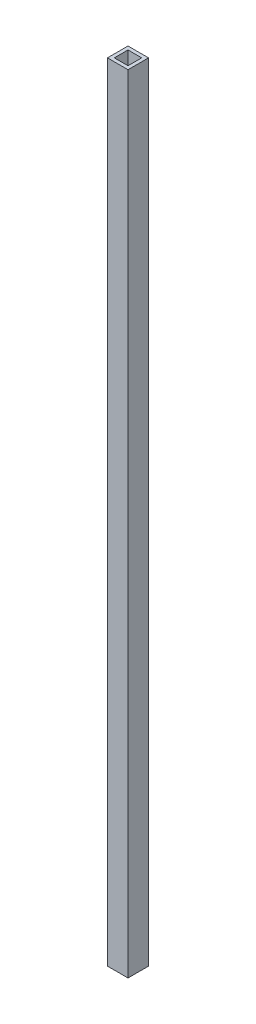
ISO-10303-21;
HEADER;
FILE_DESCRIPTION(('STEP AP214'),'2;1');
FILE_NAME('part.step','',(''),(''),'','','');
FILE_SCHEMA(('AUTOMOTIVE_DESIGN { 1 0 10303 214 1 1 1 1 }'));
ENDSEC;
DATA;
#1=APPLICATION_CONTEXT('core data for automotive mechanical design processes');
#2=APPLICATION_PROTOCOL_DEFINITION('international standard','automotive_design',2000,#1);
#3=PRODUCT_CONTEXT('',#1,'mechanical');
#4=PRODUCT('Part','Part','',(#3));
#5=PRODUCT_RELATED_PRODUCT_CATEGORY('part','',(#4));
#6=PRODUCT_DEFINITION_FORMATION('','',#4);
#7=PRODUCT_DEFINITION_CONTEXT('part definition',#1,'design');
#8=PRODUCT_DEFINITION('design','',#6,#7);
#9=PRODUCT_DEFINITION_SHAPE('','',#8);
#10=(LENGTH_UNIT() NAMED_UNIT(*) SI_UNIT(.MILLI.,.METRE.));
#11=(NAMED_UNIT(*) PLANE_ANGLE_UNIT() SI_UNIT($,.RADIAN.));
#12=(NAMED_UNIT(*) SI_UNIT($,.STERADIAN.) SOLID_ANGLE_UNIT());
#13=UNCERTAINTY_MEASURE_WITH_UNIT(LENGTH_MEASURE(1.E-05),#10,'distance_accuracy_value','');
#14=(GEOMETRIC_REPRESENTATION_CONTEXT(3) GLOBAL_UNCERTAINTY_ASSIGNED_CONTEXT((#13)) GLOBAL_UNIT_ASSIGNED_CONTEXT((#10,
#11,#12)) REPRESENTATION_CONTEXT('',''));
#15=CARTESIAN_POINT('',(0.,0.,0.));
#16=DIRECTION('',(0.,0.,1.));
#17=DIRECTION('',(1.,0.,0.));
#18=AXIS2_PLACEMENT_3D('',#15,#16,#17);
#19=CARTESIAN_POINT('',(0.,730.25,0.));
#20=DIRECTION('',(0.,1.,0.));
#21=DIRECTION('',(0.,0.,1.));
#22=AXIS2_PLACEMENT_3D('',#19,#20,#21);
#23=PLANE('',#22);
#24=DIRECTION('',(0.,0.,1.));
#25=VECTOR('',#24,1.);
#26=CARTESIAN_POINT('',(0.,730.25,0.));
#27=LINE('',#26,#25);
#28=CARTESIAN_POINT('',(0.,730.25,-19.05));
#29=VERTEX_POINT('',#28);
#30=CARTESIAN_POINT('',(0.,730.25,0.));
#31=VERTEX_POINT('',#30);
#32=EDGE_CURVE('E158',#29,#31,#27,.T.);
#33=ORIENTED_EDGE('',*,*,#32,.T.);
#34=DIRECTION('',(1.,0.,0.));
#35=VECTOR('',#34,1.);
#36=CARTESIAN_POINT('',(0.,730.25,0.));
#37=LINE('',#36,#35);
#38=CARTESIAN_POINT('',(19.05,730.25,0.));
#39=VERTEX_POINT('',#38);
#40=EDGE_CURVE('E161',#31,#39,#37,.T.);
#41=ORIENTED_EDGE('',*,*,#40,.T.);
#42=DIRECTION('',(0.,0.,-1.));
#43=VECTOR('',#42,1.);
#44=CARTESIAN_POINT('',(19.05,730.25,0.));
#45=LINE('',#44,#43);
#46=CARTESIAN_POINT('',(19.05,730.25,-19.05));
#47=VERTEX_POINT('',#46);
#48=EDGE_CURVE('E164',#39,#47,#45,.T.);
#49=ORIENTED_EDGE('',*,*,#48,.T.);
#50=DIRECTION('',(-1.,0.,0.));
#51=VECTOR('',#50,1.);
#52=CARTESIAN_POINT('',(0.,730.25,-19.05));
#53=LINE('',#52,#51);
#54=EDGE_CURVE('E166',#47,#29,#53,.T.);
#55=ORIENTED_EDGE('',*,*,#54,.T.);
#56=EDGE_LOOP('',(#33,#41,#49,#55));
#57=FACE_BOUND('',#56,.T.);
#58=DIRECTION('',(1.,0.,0.));
#59=VECTOR('',#58,1.);
#60=CARTESIAN_POINT('',(0.,730.25,-3.175));
#61=LINE('',#60,#59);
#62=CARTESIAN_POINT('',(3.175,730.25,-3.175));
#63=VERTEX_POINT('',#62);
#64=CARTESIAN_POINT('',(15.875,730.25,-3.175));
#65=VERTEX_POINT('',#64);
#66=EDGE_CURVE('E130',#63,#65,#61,.T.);
#67=ORIENTED_EDGE('',*,*,#66,.F.);
#68=DIRECTION('',(0.,0.,1.));
#69=VECTOR('',#68,1.);
#70=CARTESIAN_POINT('',(3.175,730.25,0.));
#71=LINE('',#70,#69);
#72=CARTESIAN_POINT('',(3.175,730.25,-15.875));
#73=VERTEX_POINT('',#72);
#74=EDGE_CURVE('E122',#73,#63,#71,.T.);
#75=ORIENTED_EDGE('',*,*,#74,.F.);
#76=DIRECTION('',(-1.,0.,0.));
#77=VECTOR('',#76,1.);
#78=CARTESIAN_POINT('',(0.,730.25,-15.875));
#79=LINE('',#78,#77);
#80=CARTESIAN_POINT('',(15.875,730.25,-15.875));
#81=VERTEX_POINT('',#80);
#82=EDGE_CURVE('E144',#81,#73,#79,.T.);
#83=ORIENTED_EDGE('',*,*,#82,.F.);
#84=DIRECTION('',(0.,0.,-1.));
#85=VECTOR('',#84,1.);
#86=CARTESIAN_POINT('',(15.875,730.25,0.));
#87=LINE('',#86,#85);
#88=EDGE_CURVE('E142',#65,#81,#87,.T.);
#89=ORIENTED_EDGE('',*,*,#88,.F.);
#90=EDGE_LOOP('',(#67,#75,#83,#89));
#91=FACE_BOUND('',#90,.T.);
#92=ADVANCED_FACE('F57',(#57,#91),#23,.T.);
#93=CARTESIAN_POINT('',(0.,0.,0.));
#94=DIRECTION('',(0.,1.,0.));
#95=DIRECTION('',(0.,0.,1.));
#96=AXIS2_PLACEMENT_3D('',#93,#94,#95);
#97=PLANE('',#96);
#98=DIRECTION('',(0.,0.,1.));
#99=VECTOR('',#98,1.);
#100=CARTESIAN_POINT('',(0.,0.,0.));
#101=LINE('',#100,#99);
#102=CARTESIAN_POINT('',(0.,0.,-19.05));
#103=VERTEX_POINT('',#102);
#104=CARTESIAN_POINT('',(0.,0.,0.));
#105=VERTEX_POINT('',#104);
#106=EDGE_CURVE('E138',#103,#105,#101,.T.);
#107=ORIENTED_EDGE('',*,*,#106,.F.);
#108=DIRECTION('',(-1.,0.,0.));
#109=VECTOR('',#108,1.);
#110=CARTESIAN_POINT('',(0.,0.,-19.05));
#111=LINE('',#110,#109);
#112=CARTESIAN_POINT('',(19.05,0.,-19.05));
#113=VERTEX_POINT('',#112);
#114=EDGE_CURVE('E162',#113,#103,#111,.T.);
#115=ORIENTED_EDGE('',*,*,#114,.F.);
#116=DIRECTION('',(0.,0.,-1.));
#117=VECTOR('',#116,1.);
#118=CARTESIAN_POINT('',(19.05,0.,0.));
#119=LINE('',#118,#117);
#120=CARTESIAN_POINT('',(19.05,0.,0.));
#121=VERTEX_POINT('',#120);
#122=EDGE_CURVE('E173',#121,#113,#119,.T.);
#123=ORIENTED_EDGE('',*,*,#122,.F.);
#124=DIRECTION('',(1.,0.,0.));
#125=VECTOR('',#124,1.);
#126=CARTESIAN_POINT('',(0.,0.,0.));
#127=LINE('',#126,#125);
#128=EDGE_CURVE('E171',#105,#121,#127,.T.);
#129=ORIENTED_EDGE('',*,*,#128,.F.);
#130=EDGE_LOOP('',(#107,#115,#123,#129));
#131=FACE_BOUND('',#130,.T.);
#132=DIRECTION('',(0.,0.,1.));
#133=VECTOR('',#132,1.);
#134=CARTESIAN_POINT('',(3.175,0.,0.));
#135=LINE('',#134,#133);
#136=CARTESIAN_POINT('',(3.175,0.,-15.875));
#137=VERTEX_POINT('',#136);
#138=CARTESIAN_POINT('',(3.175,0.,-3.175));
#139=VERTEX_POINT('',#138);
#140=EDGE_CURVE('E80',#137,#139,#135,.T.);
#141=ORIENTED_EDGE('',*,*,#140,.T.);
#142=DIRECTION('',(1.,0.,0.));
#143=VECTOR('',#142,1.);
#144=CARTESIAN_POINT('',(0.,0.,-3.175));
#145=LINE('',#144,#143);
#146=CARTESIAN_POINT('',(15.875,0.,-3.175));
#147=VERTEX_POINT('',#146);
#148=EDGE_CURVE('E137',#139,#147,#145,.T.);
#149=ORIENTED_EDGE('',*,*,#148,.T.);
#150=DIRECTION('',(0.,0.,-1.));
#151=VECTOR('',#150,1.);
#152=CARTESIAN_POINT('',(15.875,0.,0.));
#153=LINE('',#152,#151);
#154=CARTESIAN_POINT('',(15.875,0.,-15.875));
#155=VERTEX_POINT('',#154);
#156=EDGE_CURVE('E150',#147,#155,#153,.T.);
#157=ORIENTED_EDGE('',*,*,#156,.T.);
#158=DIRECTION('',(-1.,0.,0.));
#159=VECTOR('',#158,1.);
#160=CARTESIAN_POINT('',(0.,0.,-15.875));
#161=LINE('',#160,#159);
#162=EDGE_CURVE('E131',#155,#137,#161,.T.);
#163=ORIENTED_EDGE('',*,*,#162,.T.);
#164=EDGE_LOOP('',(#141,#149,#157,#163));
#165=FACE_BOUND('',#164,.T.);
#166=ADVANCED_FACE('F191',(#131,#165),#97,.F.);
#167=CARTESIAN_POINT('',(0.,730.25,0.));
#168=DIRECTION('',(1.,0.,0.));
#169=DIRECTION('',(0.,0.,-1.));
#170=AXIS2_PLACEMENT_3D('',#167,#168,#169);
#171=PLANE('',#170);
#172=ORIENTED_EDGE('',*,*,#106,.T.);
#173=DIRECTION('',(0.,-1.,0.));
#174=VECTOR('',#173,1.);
#175=CARTESIAN_POINT('',(0.,730.25,0.));
#176=LINE('',#175,#174);
#177=EDGE_CURVE('E12',#31,#105,#176,.T.);
#178=ORIENTED_EDGE('',*,*,#177,.F.);
#179=ORIENTED_EDGE('',*,*,#32,.F.);
#180=DIRECTION('',(0.,-1.,0.));
#181=VECTOR('',#180,1.);
#182=CARTESIAN_POINT('',(0.,730.25,-19.05));
#183=LINE('',#182,#181);
#184=EDGE_CURVE('E168',#29,#103,#183,.T.);
#185=ORIENTED_EDGE('',*,*,#184,.T.);
#186=EDGE_LOOP('',(#172,#178,#179,#185));
#187=FACE_BOUND('',#186,.T.);
#188=ADVANCED_FACE('F59',(#187),#171,.F.);
#189=CARTESIAN_POINT('',(0.,730.25,0.));
#190=DIRECTION('',(0.,0.,-1.));
#191=DIRECTION('',(-1.,0.,0.));
#192=AXIS2_PLACEMENT_3D('',#189,#190,#191);
#193=PLANE('',#192);
#194=ORIENTED_EDGE('',*,*,#128,.T.);
#195=DIRECTION('',(0.,-1.,0.));
#196=VECTOR('',#195,1.);
#197=CARTESIAN_POINT('',(19.05,730.25,0.));
#198=LINE('',#197,#196);
#199=EDGE_CURVE('E65',#39,#121,#198,.T.);
#200=ORIENTED_EDGE('',*,*,#199,.F.);
#201=ORIENTED_EDGE('',*,*,#40,.F.);
#202=ORIENTED_EDGE('',*,*,#177,.T.);
#203=EDGE_LOOP('',(#194,#200,#201,#202));
#204=FACE_BOUND('',#203,.T.);
#205=ADVANCED_FACE('F201',(#204),#193,.F.);
#206=CARTESIAN_POINT('',(19.05,730.25,0.));
#207=DIRECTION('',(-1.,0.,0.));
#208=DIRECTION('',(0.,0.,1.));
#209=AXIS2_PLACEMENT_3D('',#206,#207,#208);
#210=PLANE('',#209);
#211=ORIENTED_EDGE('',*,*,#122,.T.);
#212=DIRECTION('',(0.,-1.,0.));
#213=VECTOR('',#212,1.);
#214=CARTESIAN_POINT('',(19.05,730.25,-19.05));
#215=LINE('',#214,#213);
#216=EDGE_CURVE('E178',#47,#113,#215,.T.);
#217=ORIENTED_EDGE('',*,*,#216,.F.);
#218=ORIENTED_EDGE('',*,*,#48,.F.);
#219=ORIENTED_EDGE('',*,*,#199,.T.);
#220=EDGE_LOOP('',(#211,#217,#218,#219));
#221=FACE_BOUND('',#220,.T.);
#222=ADVANCED_FACE('F185',(#221),#210,.F.);
#223=CARTESIAN_POINT('',(0.,730.25,-19.05));
#224=DIRECTION('',(0.,0.,1.));
#225=DIRECTION('',(1.,0.,0.));
#226=AXIS2_PLACEMENT_3D('',#223,#224,#225);
#227=PLANE('',#226);
#228=ORIENTED_EDGE('',*,*,#114,.T.);
#229=ORIENTED_EDGE('',*,*,#184,.F.);
#230=ORIENTED_EDGE('',*,*,#54,.F.);
#231=ORIENTED_EDGE('',*,*,#216,.T.);
#232=EDGE_LOOP('',(#228,#229,#230,#231));
#233=FACE_BOUND('',#232,.T.);
#234=ADVANCED_FACE('F195',(#233),#227,.F.);
#235=CARTESIAN_POINT('',(3.175,730.25,0.));
#236=DIRECTION('',(1.,0.,0.));
#237=DIRECTION('',(0.,0.,-1.));
#238=AXIS2_PLACEMENT_3D('',#235,#236,#237);
#239=PLANE('',#238);
#240=ORIENTED_EDGE('',*,*,#140,.F.);
#241=DIRECTION('',(0.,-1.,0.));
#242=VECTOR('',#241,1.);
#243=CARTESIAN_POINT('',(3.175,730.25,-15.875));
#244=LINE('',#243,#242);
#245=EDGE_CURVE('E126',#73,#137,#244,.T.);
#246=ORIENTED_EDGE('',*,*,#245,.F.);
#247=ORIENTED_EDGE('',*,*,#74,.T.);
#248=DIRECTION('',(0.,-1.,0.));
#249=VECTOR('',#248,1.);
#250=CARTESIAN_POINT('',(3.175,730.25,-3.175));
#251=LINE('',#250,#249);
#252=EDGE_CURVE('E125',#63,#139,#251,.T.);
#253=ORIENTED_EDGE('',*,*,#252,.T.);
#254=EDGE_LOOP('',(#240,#246,#247,#253));
#255=FACE_BOUND('',#254,.T.);
#256=ADVANCED_FACE('F124',(#255),#239,.T.);
#257=CARTESIAN_POINT('',(0.,730.25,-3.175));
#258=DIRECTION('',(0.,0.,-1.));
#259=DIRECTION('',(-1.,0.,0.));
#260=AXIS2_PLACEMENT_3D('',#257,#258,#259);
#261=PLANE('',#260);
#262=ORIENTED_EDGE('',*,*,#148,.F.);
#263=ORIENTED_EDGE('',*,*,#252,.F.);
#264=ORIENTED_EDGE('',*,*,#66,.T.);
#265=DIRECTION('',(0.,-1.,0.));
#266=VECTOR('',#265,1.);
#267=CARTESIAN_POINT('',(15.875,730.25,-3.175));
#268=LINE('',#267,#266);
#269=EDGE_CURVE('E139',#65,#147,#268,.T.);
#270=ORIENTED_EDGE('',*,*,#269,.T.);
#271=EDGE_LOOP('',(#262,#263,#264,#270));
#272=FACE_BOUND('',#271,.T.);
#273=ADVANCED_FACE('F134',(#272),#261,.T.);
#274=CARTESIAN_POINT('',(15.875,730.25,0.));
#275=DIRECTION('',(-1.,0.,0.));
#276=DIRECTION('',(0.,0.,1.));
#277=AXIS2_PLACEMENT_3D('',#274,#275,#276);
#278=PLANE('',#277);
#279=ORIENTED_EDGE('',*,*,#156,.F.);
#280=ORIENTED_EDGE('',*,*,#269,.F.);
#281=ORIENTED_EDGE('',*,*,#88,.T.);
#282=DIRECTION('',(0.,-1.,0.));
#283=VECTOR('',#282,1.);
#284=CARTESIAN_POINT('',(15.875,730.25,-15.875));
#285=LINE('',#284,#283);
#286=EDGE_CURVE('E72',#81,#155,#285,.T.);
#287=ORIENTED_EDGE('',*,*,#286,.T.);
#288=EDGE_LOOP('',(#279,#280,#281,#287));
#289=FACE_BOUND('',#288,.T.);
#290=ADVANCED_FACE('F224',(#289),#278,.T.);
#291=CARTESIAN_POINT('',(0.,730.25,-15.875));
#292=DIRECTION('',(0.,0.,1.));
#293=DIRECTION('',(1.,0.,0.));
#294=AXIS2_PLACEMENT_3D('',#291,#292,#293);
#295=PLANE('',#294);
#296=ORIENTED_EDGE('',*,*,#162,.F.);
#297=ORIENTED_EDGE('',*,*,#286,.F.);
#298=ORIENTED_EDGE('',*,*,#82,.T.);
#299=ORIENTED_EDGE('',*,*,#245,.T.);
#300=EDGE_LOOP('',(#296,#297,#298,#299));
#301=FACE_BOUND('',#300,.T.);
#302=ADVANCED_FACE('F228',(#301),#295,.T.);
#303=CLOSED_SHELL('',(#92,#166,#188,#205,#222,#234,#256,#273,#290,#302));
#304=MANIFOLD_SOLID_BREP('B2',#303);
#305=ADVANCED_BREP_SHAPE_REPRESENTATION('',(#18,#304),#14);
#306=SHAPE_DEFINITION_REPRESENTATION(#9,#305);
ENDSEC;
END-ISO-10303-21;
